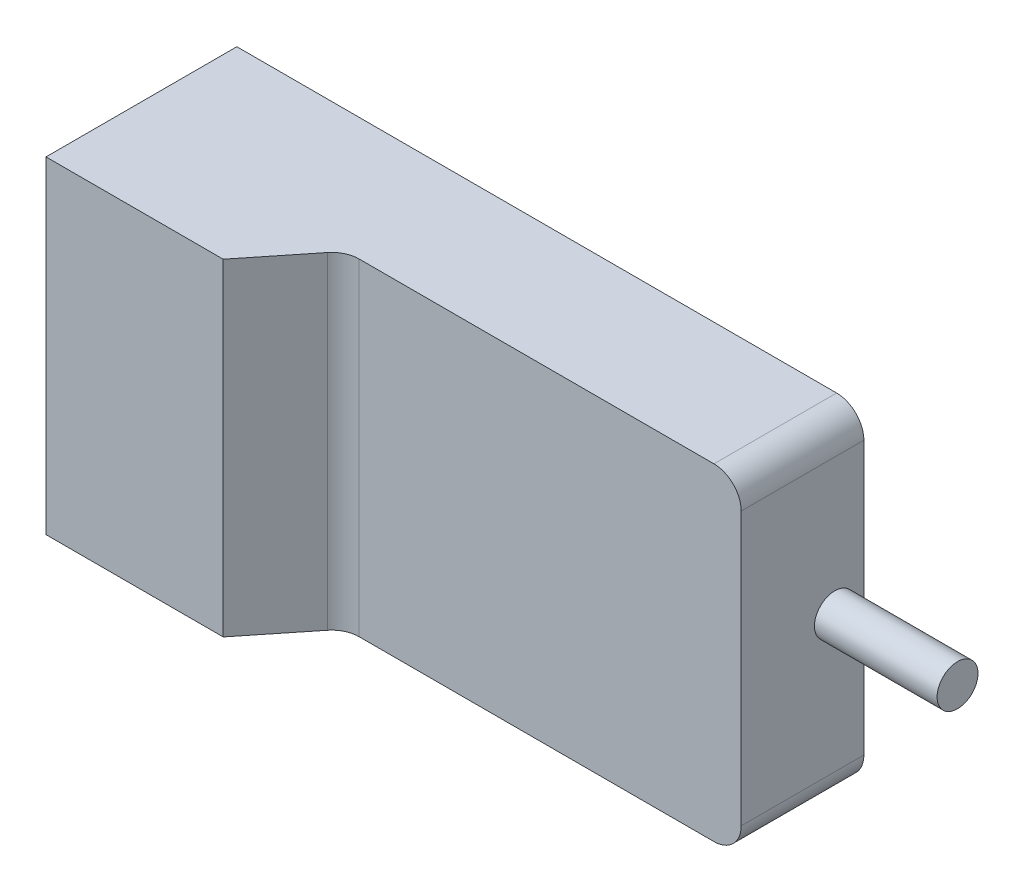
ISO-10303-21;
HEADER;
FILE_DESCRIPTION(('STEP AP214'),'2;1');
FILE_NAME('part.step','',(''),(''),'','','');
FILE_SCHEMA(('AUTOMOTIVE_DESIGN { 1 0 10303 214 1 1 1 1 }'));
ENDSEC;
DATA;
#1=APPLICATION_CONTEXT('core data for automotive mechanical design processes');
#2=APPLICATION_PROTOCOL_DEFINITION('international standard','automotive_design',2000,#1);
#3=PRODUCT_CONTEXT('',#1,'mechanical');
#4=PRODUCT('Part','Part','',(#3));
#5=PRODUCT_RELATED_PRODUCT_CATEGORY('part','',(#4));
#6=PRODUCT_DEFINITION_FORMATION('','',#4);
#7=PRODUCT_DEFINITION_CONTEXT('part definition',#1,'design');
#8=PRODUCT_DEFINITION('design','',#6,#7);
#9=PRODUCT_DEFINITION_SHAPE('','',#8);
#10=(LENGTH_UNIT() NAMED_UNIT(*) SI_UNIT(.MILLI.,.METRE.));
#11=(NAMED_UNIT(*) PLANE_ANGLE_UNIT() SI_UNIT($,.RADIAN.));
#12=(NAMED_UNIT(*) SI_UNIT($,.STERADIAN.) SOLID_ANGLE_UNIT());
#13=UNCERTAINTY_MEASURE_WITH_UNIT(LENGTH_MEASURE(1.E-05),#10,'distance_accuracy_value','');
#14=(GEOMETRIC_REPRESENTATION_CONTEXT(3) GLOBAL_UNCERTAINTY_ASSIGNED_CONTEXT((#13)) GLOBAL_UNIT_ASSIGNED_CONTEXT((#10,
#11,#12)) REPRESENTATION_CONTEXT('',''));
#15=CARTESIAN_POINT('',(0.,0.,0.));
#16=DIRECTION('',(0.,0.,1.));
#17=DIRECTION('',(1.,0.,0.));
#18=AXIS2_PLACEMENT_3D('',#15,#16,#17);
#19=CARTESIAN_POINT('',(23.,12.,9.));
#20=DIRECTION('',(-1.,0.,0.));
#21=DIRECTION('',(0.,-1.,0.));
#22=AXIS2_PLACEMENT_3D('',#19,#20,#21);
#23=PLANE('',#22);
#24=DIRECTION('',(0.,1.,0.));
#25=VECTOR('',#24,1.);
#26=CARTESIAN_POINT('',(23.,12.,9.));
#27=LINE('',#26,#25);
#28=CARTESIAN_POINT('',(23.,-10.,9.));
#29=VERTEX_POINT('',#28);
#30=CARTESIAN_POINT('',(23.,10.,9.));
#31=VERTEX_POINT('',#30);
#32=EDGE_CURVE('E219',#29,#31,#27,.T.);
#33=ORIENTED_EDGE('',*,*,#32,.F.);
#34=DIRECTION('',(0.,0.,-1.));
#35=VECTOR('',#34,1.);
#36=CARTESIAN_POINT('',(23.,-10.,9.));
#37=LINE('',#36,#35);
#38=CARTESIAN_POINT('',(23.,-10.,0.));
#39=VERTEX_POINT('',#38);
#40=EDGE_CURVE('E292',#29,#39,#37,.T.);
#41=ORIENTED_EDGE('',*,*,#40,.T.);
#42=DIRECTION('',(0.,1.,0.));
#43=VECTOR('',#42,1.);
#44=CARTESIAN_POINT('',(23.,12.,0.));
#45=LINE('',#44,#43);
#46=CARTESIAN_POINT('',(23.,10.,0.));
#47=VERTEX_POINT('',#46);
#48=EDGE_CURVE('E130',#39,#47,#45,.T.);
#49=ORIENTED_EDGE('',*,*,#48,.T.);
#50=DIRECTION('',(0.,0.,-1.));
#51=VECTOR('',#50,1.);
#52=CARTESIAN_POINT('',(23.,10.,9.));
#53=LINE('',#52,#51);
#54=EDGE_CURVE('E295',#47,#31,#53,.F.);
#55=ORIENTED_EDGE('',*,*,#54,.T.);
#56=EDGE_LOOP('',(#33,#41,#49,#55));
#57=FACE_BOUND('',#56,.T.);
#58=CARTESIAN_POINT('',(23.,0.,2.12857382853632));
#59=DIRECTION('',(-1.,0.,0.));
#60=DIRECTION('',(0.,-1.,0.));
#61=AXIS2_PLACEMENT_3D('',#58,#59,#60);
#62=CIRCLE('',#61,1.5);
#63=CARTESIAN_POINT('',(23.,-1.5,2.12857382853632));
#64=VERTEX_POINT('',#63);
#65=EDGE_CURVE('E208',#64,#64,#62,.F.);
#66=ORIENTED_EDGE('',*,*,#65,.F.);
#67=EDGE_LOOP('',(#66));
#68=FACE_BOUND('',#67,.T.);
#69=ADVANCED_FACE('F45',(#57,#68),#23,.F.);
#70=CARTESIAN_POINT('',(0.,0.,9.));
#71=DIRECTION('',(0.,0.,1.));
#72=DIRECTION('',(1.,0.,0.));
#73=AXIS2_PLACEMENT_3D('',#70,#71,#72);
#74=PLANE('',#73);
#75=DIRECTION('',(-1.,0.,0.));
#76=VECTOR('',#75,1.);
#77=CARTESIAN_POINT('',(-23.,12.,9.));
#78=LINE('',#77,#76);
#79=CARTESIAN_POINT('',(21.,12.,9.));
#80=VERTEX_POINT('',#79);
#81=CARTESIAN_POINT('',(-5.03875030502686,12.,9.));
#82=VERTEX_POINT('',#81);
#83=EDGE_CURVE('E214',#80,#82,#78,.T.);
#84=ORIENTED_EDGE('',*,*,#83,.T.);
#85=DIRECTION('',(0.,1.,0.));
#86=VECTOR('',#85,1.);
#87=CARTESIAN_POINT('',(-5.03875030502685,0.,9.));
#88=LINE('',#87,#86);
#89=CARTESIAN_POINT('',(-5.03875030502685,-12.,9.));
#90=VERTEX_POINT('',#89);
#91=EDGE_CURVE('E297',#82,#90,#88,.F.);
#92=ORIENTED_EDGE('',*,*,#91,.T.);
#93=DIRECTION('',(1.,0.,0.));
#94=VECTOR('',#93,1.);
#95=CARTESIAN_POINT('',(-23.,-12.,9.));
#96=LINE('',#95,#94);
#97=CARTESIAN_POINT('',(21.,-12.,9.));
#98=VERTEX_POINT('',#97);
#99=EDGE_CURVE('E218',#90,#98,#96,.T.);
#100=ORIENTED_EDGE('',*,*,#99,.T.);
#101=CARTESIAN_POINT('',(21.,-10.,9.));
#102=DIRECTION('',(0.,0.,1.));
#103=DIRECTION('',(1.,0.,0.));
#104=AXIS2_PLACEMENT_3D('',#101,#102,#103);
#105=CIRCLE('',#104,2.);
#106=EDGE_CURVE('E299',#98,#29,#105,.T.);
#107=ORIENTED_EDGE('',*,*,#106,.T.);
#108=ORIENTED_EDGE('',*,*,#32,.T.);
#109=CARTESIAN_POINT('',(21.,10.,9.));
#110=DIRECTION('',(0.,0.,1.));
#111=DIRECTION('',(1.,0.,0.));
#112=AXIS2_PLACEMENT_3D('',#109,#110,#111);
#113=CIRCLE('',#112,2.);
#114=EDGE_CURVE('E213',#31,#80,#113,.T.);
#115=ORIENTED_EDGE('',*,*,#114,.T.);
#116=EDGE_LOOP('',(#84,#92,#100,#107,#108,#115));
#117=FACE_BOUND('',#116,.T.);
#118=ADVANCED_FACE('F170',(#117),#74,.T.);
#119=CARTESIAN_POINT('',(-23.,12.,9.));
#120=DIRECTION('',(0.,-1.,0.));
#121=DIRECTION('',(0.,0.,-1.));
#122=AXIS2_PLACEMENT_3D('',#119,#120,#121);
#123=PLANE('',#122);
#124=ORIENTED_EDGE('',*,*,#83,.F.);
#125=DIRECTION('',(0.,0.,-1.));
#126=VECTOR('',#125,1.);
#127=CARTESIAN_POINT('',(21.,12.,9.));
#128=LINE('',#127,#126);
#129=CARTESIAN_POINT('',(21.,12.,0.));
#130=VERTEX_POINT('',#129);
#131=EDGE_CURVE('E284',#80,#130,#128,.T.);
#132=ORIENTED_EDGE('',*,*,#131,.T.);
#133=DIRECTION('',(-1.,0.,0.));
#134=VECTOR('',#133,1.);
#135=CARTESIAN_POINT('',(-23.,12.,0.));
#136=LINE('',#135,#134);
#137=CARTESIAN_POINT('',(-23.,12.,0.));
#138=VERTEX_POINT('',#137);
#139=EDGE_CURVE('E228',#130,#138,#136,.T.);
#140=ORIENTED_EDGE('',*,*,#139,.T.);
#141=DIRECTION('',(0.,0.,-1.));
#142=VECTOR('',#141,1.);
#143=CARTESIAN_POINT('',(-23.,12.,9.));
#144=LINE('',#143,#142);
#145=CARTESIAN_POINT('',(-23.,12.,14.));
#146=VERTEX_POINT('',#145);
#147=EDGE_CURVE('E234',#146,#138,#144,.T.);
#148=ORIENTED_EDGE('',*,*,#147,.F.);
#149=DIRECTION('',(-1.,0.,0.));
#150=VECTOR('',#149,1.);
#151=CARTESIAN_POINT('',(-23.,12.,14.));
#152=LINE('',#151,#150);
#153=CARTESIAN_POINT('',(-10.,12.,14.));
#154=VERTEX_POINT('',#153);
#155=EDGE_CURVE('E142',#154,#146,#152,.T.);
#156=ORIENTED_EDGE('',*,*,#155,.F.);
#157=DIRECTION('',(-0.624695047554425,0.,0.78086880944303));
#158=VECTOR('',#157,1.);
#159=CARTESIAN_POINT('',(-5.99999999999999,12.,9.));
#160=LINE('',#159,#158);
#161=CARTESIAN_POINT('',(-6.60048792391292,12.,9.75060990489115));
#162=VERTEX_POINT('',#161);
#163=EDGE_CURVE('E131',#162,#154,#160,.T.);
#164=ORIENTED_EDGE('',*,*,#163,.F.);
#165=CARTESIAN_POINT('',(-5.03875030502685,12.,11.));
#166=DIRECTION('',(0.,-1.,0.));
#167=DIRECTION('',(0.,0.,-1.));
#168=AXIS2_PLACEMENT_3D('',#165,#166,#167);
#169=CIRCLE('',#168,2.);
#170=EDGE_CURVE('E53',#162,#82,#169,.T.);
#171=ORIENTED_EDGE('',*,*,#170,.T.);
#172=EDGE_LOOP('',(#124,#132,#140,#148,#156,#164,#171));
#173=FACE_BOUND('',#172,.T.);
#174=ADVANCED_FACE('F260',(#173),#123,.F.);
#175=CARTESIAN_POINT('',(-23.,12.,9.));
#176=DIRECTION('',(1.,0.,0.));
#177=DIRECTION('',(0.,0.,-1.));
#178=AXIS2_PLACEMENT_3D('',#175,#176,#177);
#179=PLANE('',#178);
#180=DIRECTION('',(0.,-1.,0.));
#181=VECTOR('',#180,1.);
#182=CARTESIAN_POINT('',(-23.,12.,0.));
#183=LINE('',#182,#181);
#184=CARTESIAN_POINT('',(-23.,-12.,0.));
#185=VERTEX_POINT('',#184);
#186=EDGE_CURVE('E230',#138,#185,#183,.T.);
#187=ORIENTED_EDGE('',*,*,#186,.T.);
#188=DIRECTION('',(0.,0.,-1.));
#189=VECTOR('',#188,1.);
#190=CARTESIAN_POINT('',(-23.,-12.,9.));
#191=LINE('',#190,#189);
#192=CARTESIAN_POINT('',(-23.,-12.,14.));
#193=VERTEX_POINT('',#192);
#194=EDGE_CURVE('E237',#193,#185,#191,.T.);
#195=ORIENTED_EDGE('',*,*,#194,.F.);
#196=DIRECTION('',(0.,-1.,0.));
#197=VECTOR('',#196,1.);
#198=CARTESIAN_POINT('',(-23.,12.,14.));
#199=LINE('',#198,#197);
#200=EDGE_CURVE('E149',#146,#193,#199,.T.);
#201=ORIENTED_EDGE('',*,*,#200,.F.);
#202=ORIENTED_EDGE('',*,*,#147,.T.);
#203=EDGE_LOOP('',(#187,#195,#201,#202));
#204=FACE_BOUND('',#203,.T.);
#205=ADVANCED_FACE('F256',(#204),#179,.F.);
#206=CARTESIAN_POINT('',(-23.,-12.,9.));
#207=DIRECTION('',(0.,1.,0.));
#208=DIRECTION('',(0.,0.,1.));
#209=AXIS2_PLACEMENT_3D('',#206,#207,#208);
#210=PLANE('',#209);
#211=DIRECTION('',(1.,0.,0.));
#212=VECTOR('',#211,1.);
#213=CARTESIAN_POINT('',(-23.,-12.,0.));
#214=LINE('',#213,#212);
#215=CARTESIAN_POINT('',(21.,-12.,0.));
#216=VERTEX_POINT('',#215);
#217=EDGE_CURVE('E232',#185,#216,#214,.T.);
#218=ORIENTED_EDGE('',*,*,#217,.T.);
#219=DIRECTION('',(0.,0.,-1.));
#220=VECTOR('',#219,1.);
#221=CARTESIAN_POINT('',(21.,-12.,9.));
#222=LINE('',#221,#220);
#223=EDGE_CURVE('E286',#216,#98,#222,.F.);
#224=ORIENTED_EDGE('',*,*,#223,.T.);
#225=ORIENTED_EDGE('',*,*,#99,.F.);
#226=CARTESIAN_POINT('',(-5.03875030502685,-12.,11.));
#227=DIRECTION('',(0.,1.,0.));
#228=DIRECTION('',(0.,0.,1.));
#229=AXIS2_PLACEMENT_3D('',#226,#227,#228);
#230=CIRCLE('',#229,2.);
#231=CARTESIAN_POINT('',(-6.60048792391291,-12.,9.75060990489115));
#232=VERTEX_POINT('',#231);
#233=EDGE_CURVE('E12',#90,#232,#230,.T.);
#234=ORIENTED_EDGE('',*,*,#233,.T.);
#235=DIRECTION('',(-0.624695047554425,0.,0.78086880944303));
#236=VECTOR('',#235,1.);
#237=CARTESIAN_POINT('',(-5.99999999999999,-12.,9.));
#238=LINE('',#237,#236);
#239=CARTESIAN_POINT('',(-9.99999999999999,-12.,14.));
#240=VERTEX_POINT('',#239);
#241=EDGE_CURVE('E117',#232,#240,#238,.T.);
#242=ORIENTED_EDGE('',*,*,#241,.T.);
#243=DIRECTION('',(1.,0.,0.));
#244=VECTOR('',#243,1.);
#245=CARTESIAN_POINT('',(-23.,-12.,14.));
#246=LINE('',#245,#244);
#247=EDGE_CURVE('E122',#193,#240,#246,.T.);
#248=ORIENTED_EDGE('',*,*,#247,.F.);
#249=ORIENTED_EDGE('',*,*,#194,.T.);
#250=EDGE_LOOP('',(#218,#224,#225,#234,#242,#248,#249));
#251=FACE_BOUND('',#250,.T.);
#252=ADVANCED_FACE('F119',(#251),#210,.F.);
#253=CARTESIAN_POINT('',(0.,0.,0.));
#254=DIRECTION('',(0.,0.,1.));
#255=DIRECTION('',(1.,0.,0.));
#256=AXIS2_PLACEMENT_3D('',#253,#254,#255);
#257=PLANE('',#256);
#258=ORIENTED_EDGE('',*,*,#48,.F.);
#259=CARTESIAN_POINT('',(21.,-10.,0.));
#260=DIRECTION('',(0.,0.,1.));
#261=DIRECTION('',(1.,0.,0.));
#262=AXIS2_PLACEMENT_3D('',#259,#260,#261);
#263=CIRCLE('',#262,2.);
#264=EDGE_CURVE('E68',#39,#216,#263,.F.);
#265=ORIENTED_EDGE('',*,*,#264,.T.);
#266=ORIENTED_EDGE('',*,*,#217,.F.);
#267=ORIENTED_EDGE('',*,*,#186,.F.);
#268=ORIENTED_EDGE('',*,*,#139,.F.);
#269=CARTESIAN_POINT('',(21.,10.,0.));
#270=DIRECTION('',(0.,0.,1.));
#271=DIRECTION('',(1.,0.,0.));
#272=AXIS2_PLACEMENT_3D('',#269,#270,#271);
#273=CIRCLE('',#272,2.);
#274=EDGE_CURVE('E60',#130,#47,#273,.F.);
#275=ORIENTED_EDGE('',*,*,#274,.T.);
#276=EDGE_LOOP('',(#258,#265,#266,#267,#268,#275));
#277=FACE_BOUND('',#276,.T.);
#278=ADVANCED_FACE('F167',(#277),#257,.F.);
#279=CARTESIAN_POINT('',(0.,0.,14.));
#280=DIRECTION('',(0.,0.,1.));
#281=DIRECTION('',(1.,0.,0.));
#282=AXIS2_PLACEMENT_3D('',#279,#280,#281);
#283=PLANE('',#282);
#284=ORIENTED_EDGE('',*,*,#200,.T.);
#285=ORIENTED_EDGE('',*,*,#247,.T.);
#286=DIRECTION('',(0.,1.,0.));
#287=VECTOR('',#286,1.);
#288=CARTESIAN_POINT('',(-10.,12.,14.));
#289=LINE('',#288,#287);
#290=EDGE_CURVE('E134',#240,#154,#289,.T.);
#291=ORIENTED_EDGE('',*,*,#290,.T.);
#292=ORIENTED_EDGE('',*,*,#155,.T.);
#293=EDGE_LOOP('',(#284,#285,#291,#292));
#294=FACE_BOUND('',#293,.T.);
#295=ADVANCED_FACE('F147',(#294),#283,.T.);
#296=CARTESIAN_POINT('',(0.731707317073177,0.,0.585365853658542));
#297=DIRECTION('',(-0.78086880944303,0.,-0.624695047554425));
#298=DIRECTION('',(-0.624695047554425,0.,0.78086880944303));
#299=AXIS2_PLACEMENT_3D('',#296,#297,#298);
#300=PLANE('',#299);
#301=ORIENTED_EDGE('',*,*,#241,.F.);
#302=DIRECTION('',(0.,1.,0.));
#303=VECTOR('',#302,1.);
#304=CARTESIAN_POINT('',(-6.60048792391291,0.,9.75060990489115));
#305=LINE('',#304,#303);
#306=EDGE_CURVE('E211',#232,#162,#305,.T.);
#307=ORIENTED_EDGE('',*,*,#306,.T.);
#308=ORIENTED_EDGE('',*,*,#163,.T.);
#309=ORIENTED_EDGE('',*,*,#290,.F.);
#310=EDGE_LOOP('',(#301,#307,#308,#309));
#311=FACE_BOUND('',#310,.T.);
#312=ADVANCED_FACE('F136',(#311),#300,.F.);
#313=CARTESIAN_POINT('',(32.,0.,2.12857382853632));
#314=DIRECTION('',(-1.,0.,0.));
#315=DIRECTION('',(0.,-1.,0.));
#316=AXIS2_PLACEMENT_3D('',#313,#314,#315);
#317=CYLINDRICAL_SURFACE('',#316,1.5);
#318=CARTESIAN_POINT('',(32.,0.,2.12857382853632));
#319=DIRECTION('',(1.,0.,0.));
#320=DIRECTION('',(0.,1.,0.));
#321=AXIS2_PLACEMENT_3D('',#318,#319,#320);
#322=CIRCLE('',#321,1.5);
#323=CARTESIAN_POINT('',(32.,1.5,2.12857382853632));
#324=VERTEX_POINT('',#323);
#325=EDGE_CURVE('E198',#324,#324,#322,.T.);
#326=ORIENTED_EDGE('',*,*,#325,.F.);
#327=EDGE_LOOP('',(#326));
#328=FACE_BOUND('',#327,.T.);
#329=ORIENTED_EDGE('',*,*,#65,.T.);
#330=EDGE_LOOP('',(#329));
#331=FACE_BOUND('',#330,.T.);
#332=ADVANCED_FACE('F320',(#328,#331),#317,.T.);
#333=CARTESIAN_POINT('',(32.,0.,2.12857382853632));
#334=DIRECTION('',(1.,0.,0.));
#335=DIRECTION('',(0.,1.,0.));
#336=AXIS2_PLACEMENT_3D('',#333,#334,#335);
#337=PLANE('',#336);
#338=ORIENTED_EDGE('',*,*,#325,.T.);
#339=EDGE_LOOP('',(#338));
#340=FACE_BOUND('',#339,.T.);
#341=ADVANCED_FACE('F314',(#340),#337,.T.);
#342=CARTESIAN_POINT('',(-5.03875030502685,0.,11.));
#343=DIRECTION('',(0.,1.,0.));
#344=DIRECTION('',(-1.,0.,0.));
#345=AXIS2_PLACEMENT_3D('',#342,#343,#344);
#346=CYLINDRICAL_SURFACE('',#345,2.);
#347=ORIENTED_EDGE('',*,*,#233,.F.);
#348=ORIENTED_EDGE('',*,*,#91,.F.);
#349=ORIENTED_EDGE('',*,*,#170,.F.);
#350=ORIENTED_EDGE('',*,*,#306,.F.);
#351=EDGE_LOOP('',(#347,#348,#349,#350));
#352=FACE_BOUND('',#351,.T.);
#353=ADVANCED_FACE('F312',(#352),#346,.F.);
#354=CARTESIAN_POINT('',(21.,-10.,9.));
#355=DIRECTION('',(0.,0.,-1.));
#356=DIRECTION('',(-1.,0.,0.));
#357=AXIS2_PLACEMENT_3D('',#354,#355,#356);
#358=CYLINDRICAL_SURFACE('',#357,2.);
#359=ORIENTED_EDGE('',*,*,#106,.F.);
#360=ORIENTED_EDGE('',*,*,#223,.F.);
#361=ORIENTED_EDGE('',*,*,#264,.F.);
#362=ORIENTED_EDGE('',*,*,#40,.F.);
#363=EDGE_LOOP('',(#359,#360,#361,#362));
#364=FACE_BOUND('',#363,.T.);
#365=ADVANCED_FACE('F309',(#364),#358,.T.);
#366=CARTESIAN_POINT('',(21.,10.,9.));
#367=DIRECTION('',(0.,0.,-1.));
#368=DIRECTION('',(-1.,0.,0.));
#369=AXIS2_PLACEMENT_3D('',#366,#367,#368);
#370=CYLINDRICAL_SURFACE('',#369,2.);
#371=ORIENTED_EDGE('',*,*,#114,.F.);
#372=ORIENTED_EDGE('',*,*,#54,.F.);
#373=ORIENTED_EDGE('',*,*,#274,.F.);
#374=ORIENTED_EDGE('',*,*,#131,.F.);
#375=EDGE_LOOP('',(#371,#372,#373,#374));
#376=FACE_BOUND('',#375,.T.);
#377=ADVANCED_FACE('F47',(#376),#370,.T.);
#378=CLOSED_SHELL('',(#69,#118,#174,#205,#252,#278,#295,#312,#332,#341,#353,#365,#377));
#379=MANIFOLD_SOLID_BREP('B2',#378);
#380=ADVANCED_BREP_SHAPE_REPRESENTATION('',(#18,#379),#14);
#381=SHAPE_DEFINITION_REPRESENTATION(#9,#380);
ENDSEC;
END-ISO-10303-21;
